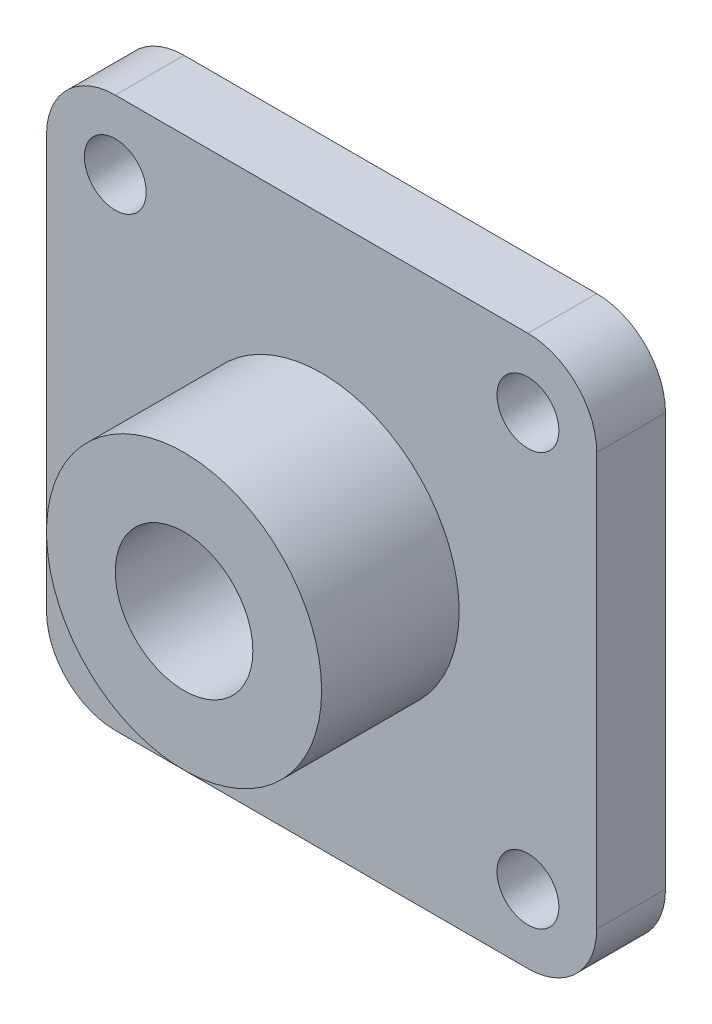
ISO-10303-21;
HEADER;
FILE_DESCRIPTION(('STEP AP214'),'2;1');
FILE_NAME('part.step','',(''),(''),'','','');
FILE_SCHEMA(('AUTOMOTIVE_DESIGN { 1 0 10303 214 1 1 1 1 }'));
ENDSEC;
DATA;
#1=APPLICATION_CONTEXT('core data for automotive mechanical design processes');
#2=APPLICATION_PROTOCOL_DEFINITION('international standard','automotive_design',2000,#1);
#3=PRODUCT_CONTEXT('',#1,'mechanical');
#4=PRODUCT('Part','Part','',(#3));
#5=PRODUCT_RELATED_PRODUCT_CATEGORY('part','',(#4));
#6=PRODUCT_DEFINITION_FORMATION('','',#4);
#7=PRODUCT_DEFINITION_CONTEXT('part definition',#1,'design');
#8=PRODUCT_DEFINITION('design','',#6,#7);
#9=PRODUCT_DEFINITION_SHAPE('','',#8);
#10=(LENGTH_UNIT() NAMED_UNIT(*) SI_UNIT(.MILLI.,.METRE.));
#11=(NAMED_UNIT(*) PLANE_ANGLE_UNIT() SI_UNIT($,.RADIAN.));
#12=(NAMED_UNIT(*) SI_UNIT($,.STERADIAN.) SOLID_ANGLE_UNIT());
#13=UNCERTAINTY_MEASURE_WITH_UNIT(LENGTH_MEASURE(1.E-05),#10,'distance_accuracy_value','');
#14=(GEOMETRIC_REPRESENTATION_CONTEXT(3) GLOBAL_UNCERTAINTY_ASSIGNED_CONTEXT((#13)) GLOBAL_UNIT_ASSIGNED_CONTEXT((#10,
#11,#12)) REPRESENTATION_CONTEXT('',''));
#15=CARTESIAN_POINT('',(0.,0.,0.));
#16=DIRECTION('',(0.,0.,1.));
#17=DIRECTION('',(1.,0.,0.));
#18=AXIS2_PLACEMENT_3D('',#15,#16,#17);
#19=CARTESIAN_POINT('',(-30.,-30.,10.));
#20=DIRECTION('',(0.,0.,-1.));
#21=DIRECTION('',(-1.,0.,0.));
#22=AXIS2_PLACEMENT_3D('',#19,#20,#21);
#23=CYLINDRICAL_SURFACE('',#22,10.);
#24=CARTESIAN_POINT('',(-30.,-30.,0.));
#25=DIRECTION('',(0.,0.,1.));
#26=DIRECTION('',(1.,0.,0.));
#27=AXIS2_PLACEMENT_3D('',#24,#25,#26);
#28=CIRCLE('',#27,10.);
#29=CARTESIAN_POINT('',(-40.,-30.,0.));
#30=VERTEX_POINT('',#29);
#31=CARTESIAN_POINT('',(-30.,-40.,0.));
#32=VERTEX_POINT('',#31);
#33=EDGE_CURVE('E158',#30,#32,#28,.T.);
#34=ORIENTED_EDGE('',*,*,#33,.T.);
#35=DIRECTION('',(0.,0.,-1.));
#36=VECTOR('',#35,1.);
#37=CARTESIAN_POINT('',(-30.,-40.,10.));
#38=LINE('',#37,#36);
#39=CARTESIAN_POINT('',(-30.,-40.,10.));
#40=VERTEX_POINT('',#39);
#41=EDGE_CURVE('E62',#40,#32,#38,.T.);
#42=ORIENTED_EDGE('',*,*,#41,.F.);
#43=CARTESIAN_POINT('',(-30.,-30.,10.));
#44=DIRECTION('',(0.,0.,1.));
#45=DIRECTION('',(1.,0.,0.));
#46=AXIS2_PLACEMENT_3D('',#43,#44,#45);
#47=CIRCLE('',#46,10.);
#48=CARTESIAN_POINT('',(-40.,-30.,10.));
#49=VERTEX_POINT('',#48);
#50=EDGE_CURVE('E181',#49,#40,#47,.T.);
#51=ORIENTED_EDGE('',*,*,#50,.F.);
#52=DIRECTION('',(0.,0.,-1.));
#53=VECTOR('',#52,1.);
#54=CARTESIAN_POINT('',(-40.,-30.,10.));
#55=LINE('',#54,#53);
#56=EDGE_CURVE('E154',#49,#30,#55,.T.);
#57=ORIENTED_EDGE('',*,*,#56,.T.);
#58=EDGE_LOOP('',(#34,#42,#51,#57));
#59=FACE_BOUND('',#58,.T.);
#60=ADVANCED_FACE('F51',(#59),#23,.T.);
#61=CARTESIAN_POINT('',(-30.,-40.,10.));
#62=DIRECTION('',(0.,1.,0.));
#63=DIRECTION('',(0.,0.,1.));
#64=AXIS2_PLACEMENT_3D('',#61,#62,#63);
#65=PLANE('',#64);
#66=DIRECTION('',(1.,0.,0.));
#67=VECTOR('',#66,1.);
#68=CARTESIAN_POINT('',(-30.,-40.,0.));
#69=LINE('',#68,#67);
#70=CARTESIAN_POINT('',(30.,-40.,0.));
#71=VERTEX_POINT('',#70);
#72=EDGE_CURVE('E162',#32,#71,#69,.T.);
#73=ORIENTED_EDGE('',*,*,#72,.T.);
#74=DIRECTION('',(0.,0.,-1.));
#75=VECTOR('',#74,1.);
#76=CARTESIAN_POINT('',(30.,-40.,10.));
#77=LINE('',#76,#75);
#78=CARTESIAN_POINT('',(30.,-40.,10.));
#79=VERTEX_POINT('',#78);
#80=EDGE_CURVE('E196',#79,#71,#77,.T.);
#81=ORIENTED_EDGE('',*,*,#80,.F.);
#82=DIRECTION('',(1.,0.,0.));
#83=VECTOR('',#82,1.);
#84=CARTESIAN_POINT('',(-30.,-40.,10.));
#85=LINE('',#84,#83);
#86=EDGE_CURVE('E115',#40,#79,#85,.T.);
#87=ORIENTED_EDGE('',*,*,#86,.F.);
#88=ORIENTED_EDGE('',*,*,#41,.T.);
#89=EDGE_LOOP('',(#73,#81,#87,#88));
#90=FACE_BOUND('',#89,.T.);
#91=ADVANCED_FACE('F277',(#90),#65,.F.);
#92=CARTESIAN_POINT('',(30.,-30.,10.));
#93=DIRECTION('',(0.,0.,-1.));
#94=DIRECTION('',(-1.,0.,0.));
#95=AXIS2_PLACEMENT_3D('',#92,#93,#94);
#96=CYLINDRICAL_SURFACE('',#95,10.);
#97=CARTESIAN_POINT('',(30.,-30.,0.));
#98=DIRECTION('',(0.,0.,1.));
#99=DIRECTION('',(1.,0.,0.));
#100=AXIS2_PLACEMENT_3D('',#97,#98,#99);
#101=CIRCLE('',#100,10.);
#102=CARTESIAN_POINT('',(40.,-30.,0.));
#103=VERTEX_POINT('',#102);
#104=EDGE_CURVE('E166',#71,#103,#101,.T.);
#105=ORIENTED_EDGE('',*,*,#104,.T.);
#106=DIRECTION('',(0.,0.,-1.));
#107=VECTOR('',#106,1.);
#108=CARTESIAN_POINT('',(40.,-30.,10.));
#109=LINE('',#108,#107);
#110=CARTESIAN_POINT('',(40.,-30.,10.));
#111=VERTEX_POINT('',#110);
#112=EDGE_CURVE('E192',#111,#103,#109,.T.);
#113=ORIENTED_EDGE('',*,*,#112,.F.);
#114=CARTESIAN_POINT('',(30.,-30.,10.));
#115=DIRECTION('',(0.,0.,1.));
#116=DIRECTION('',(1.,0.,0.));
#117=AXIS2_PLACEMENT_3D('',#114,#115,#116);
#118=CIRCLE('',#117,10.);
#119=EDGE_CURVE('E239',#79,#111,#118,.T.);
#120=ORIENTED_EDGE('',*,*,#119,.F.);
#121=ORIENTED_EDGE('',*,*,#80,.T.);
#122=EDGE_LOOP('',(#105,#113,#120,#121));
#123=FACE_BOUND('',#122,.T.);
#124=ADVANCED_FACE('F281',(#123),#96,.T.);
#125=CARTESIAN_POINT('',(40.,-30.,10.));
#126=DIRECTION('',(-1.,0.,0.));
#127=DIRECTION('',(0.,0.,1.));
#128=AXIS2_PLACEMENT_3D('',#125,#126,#127);
#129=PLANE('',#128);
#130=DIRECTION('',(0.,1.,0.));
#131=VECTOR('',#130,1.);
#132=CARTESIAN_POINT('',(40.,-30.,0.));
#133=LINE('',#132,#131);
#134=CARTESIAN_POINT('',(40.,30.,0.));
#135=VERTEX_POINT('',#134);
#136=EDGE_CURVE('E169',#103,#135,#133,.T.);
#137=ORIENTED_EDGE('',*,*,#136,.T.);
#138=DIRECTION('',(0.,0.,-1.));
#139=VECTOR('',#138,1.);
#140=CARTESIAN_POINT('',(40.,30.,10.));
#141=LINE('',#140,#139);
#142=CARTESIAN_POINT('',(40.,30.,10.));
#143=VERTEX_POINT('',#142);
#144=EDGE_CURVE('E188',#143,#135,#141,.T.);
#145=ORIENTED_EDGE('',*,*,#144,.F.);
#146=DIRECTION('',(0.,1.,0.));
#147=VECTOR('',#146,1.);
#148=CARTESIAN_POINT('',(40.,-30.,10.));
#149=LINE('',#148,#147);
#150=EDGE_CURVE('E242',#111,#143,#149,.T.);
#151=ORIENTED_EDGE('',*,*,#150,.F.);
#152=ORIENTED_EDGE('',*,*,#112,.T.);
#153=EDGE_LOOP('',(#137,#145,#151,#152));
#154=FACE_BOUND('',#153,.T.);
#155=ADVANCED_FACE('F294',(#154),#129,.F.);
#156=CARTESIAN_POINT('',(30.,30.,10.));
#157=DIRECTION('',(0.,0.,-1.));
#158=DIRECTION('',(-1.,0.,0.));
#159=AXIS2_PLACEMENT_3D('',#156,#157,#158);
#160=CYLINDRICAL_SURFACE('',#159,10.);
#161=CARTESIAN_POINT('',(30.,30.,0.));
#162=DIRECTION('',(0.,0.,1.));
#163=DIRECTION('',(1.,0.,0.));
#164=AXIS2_PLACEMENT_3D('',#161,#162,#163);
#165=CIRCLE('',#164,10.);
#166=CARTESIAN_POINT('',(30.,40.,0.));
#167=VERTEX_POINT('',#166);
#168=EDGE_CURVE('E172',#135,#167,#165,.T.);
#169=ORIENTED_EDGE('',*,*,#168,.T.);
#170=DIRECTION('',(0.,0.,-1.));
#171=VECTOR('',#170,1.);
#172=CARTESIAN_POINT('',(30.,40.,10.));
#173=LINE('',#172,#171);
#174=CARTESIAN_POINT('',(30.,40.,10.));
#175=VERTEX_POINT('',#174);
#176=EDGE_CURVE('E145',#175,#167,#173,.T.);
#177=ORIENTED_EDGE('',*,*,#176,.F.);
#178=CARTESIAN_POINT('',(30.,30.,10.));
#179=DIRECTION('',(0.,0.,1.));
#180=DIRECTION('',(1.,0.,0.));
#181=AXIS2_PLACEMENT_3D('',#178,#179,#180);
#182=CIRCLE('',#181,10.);
#183=EDGE_CURVE('E134',#143,#175,#182,.T.);
#184=ORIENTED_EDGE('',*,*,#183,.F.);
#185=ORIENTED_EDGE('',*,*,#144,.T.);
#186=EDGE_LOOP('',(#169,#177,#184,#185));
#187=FACE_BOUND('',#186,.T.);
#188=ADVANCED_FACE('F297',(#187),#160,.T.);
#189=CARTESIAN_POINT('',(30.,40.,10.));
#190=DIRECTION('',(0.,-1.,0.));
#191=DIRECTION('',(0.,0.,-1.));
#192=AXIS2_PLACEMENT_3D('',#189,#190,#191);
#193=PLANE('',#192);
#194=DIRECTION('',(-1.,0.,0.));
#195=VECTOR('',#194,1.);
#196=CARTESIAN_POINT('',(30.,40.,0.));
#197=LINE('',#196,#195);
#198=CARTESIAN_POINT('',(-30.,40.,0.));
#199=VERTEX_POINT('',#198);
#200=EDGE_CURVE('E143',#167,#199,#197,.T.);
#201=ORIENTED_EDGE('',*,*,#200,.T.);
#202=DIRECTION('',(0.,0.,-1.));
#203=VECTOR('',#202,1.);
#204=CARTESIAN_POINT('',(-30.,40.,10.));
#205=LINE('',#204,#203);
#206=CARTESIAN_POINT('',(-30.,40.,10.));
#207=VERTEX_POINT('',#206);
#208=EDGE_CURVE('E140',#207,#199,#205,.T.);
#209=ORIENTED_EDGE('',*,*,#208,.F.);
#210=DIRECTION('',(-1.,0.,0.));
#211=VECTOR('',#210,1.);
#212=CARTESIAN_POINT('',(30.,40.,10.));
#213=LINE('',#212,#211);
#214=EDGE_CURVE('E128',#175,#207,#213,.T.);
#215=ORIENTED_EDGE('',*,*,#214,.F.);
#216=ORIENTED_EDGE('',*,*,#176,.T.);
#217=EDGE_LOOP('',(#201,#209,#215,#216));
#218=FACE_BOUND('',#217,.T.);
#219=ADVANCED_FACE('F141',(#218),#193,.F.);
#220=CARTESIAN_POINT('',(-30.,30.,10.));
#221=DIRECTION('',(0.,0.,-1.));
#222=DIRECTION('',(-1.,0.,0.));
#223=AXIS2_PLACEMENT_3D('',#220,#221,#222);
#224=CYLINDRICAL_SURFACE('',#223,10.);
#225=CARTESIAN_POINT('',(-30.,30.,0.));
#226=DIRECTION('',(0.,0.,1.));
#227=DIRECTION('',(1.,0.,0.));
#228=AXIS2_PLACEMENT_3D('',#225,#226,#227);
#229=CIRCLE('',#228,10.);
#230=CARTESIAN_POINT('',(-40.,30.,0.));
#231=VERTEX_POINT('',#230);
#232=EDGE_CURVE('E100',#199,#231,#229,.T.);
#233=ORIENTED_EDGE('',*,*,#232,.T.);
#234=DIRECTION('',(0.,0.,-1.));
#235=VECTOR('',#234,1.);
#236=CARTESIAN_POINT('',(-40.,30.,10.));
#237=LINE('',#236,#235);
#238=CARTESIAN_POINT('',(-40.,30.,10.));
#239=VERTEX_POINT('',#238);
#240=EDGE_CURVE('E146',#239,#231,#237,.T.);
#241=ORIENTED_EDGE('',*,*,#240,.F.);
#242=CARTESIAN_POINT('',(-30.,30.,10.));
#243=DIRECTION('',(0.,0.,1.));
#244=DIRECTION('',(1.,0.,0.));
#245=AXIS2_PLACEMENT_3D('',#242,#243,#244);
#246=CIRCLE('',#245,10.);
#247=EDGE_CURVE('E132',#207,#239,#246,.T.);
#248=ORIENTED_EDGE('',*,*,#247,.F.);
#249=ORIENTED_EDGE('',*,*,#208,.T.);
#250=EDGE_LOOP('',(#233,#241,#248,#249));
#251=FACE_BOUND('',#250,.T.);
#252=ADVANCED_FACE('F148',(#251),#224,.T.);
#253=CARTESIAN_POINT('',(-40.,30.,10.));
#254=DIRECTION('',(1.,0.,0.));
#255=DIRECTION('',(0.,0.,-1.));
#256=AXIS2_PLACEMENT_3D('',#253,#254,#255);
#257=PLANE('',#256);
#258=DIRECTION('',(0.,-1.,0.));
#259=VECTOR('',#258,1.);
#260=CARTESIAN_POINT('',(-40.,30.,0.));
#261=LINE('',#260,#259);
#262=EDGE_CURVE('E106',#231,#30,#261,.T.);
#263=ORIENTED_EDGE('',*,*,#262,.T.);
#264=ORIENTED_EDGE('',*,*,#56,.F.);
#265=DIRECTION('',(0.,-1.,0.));
#266=VECTOR('',#265,1.);
#267=CARTESIAN_POINT('',(-40.,30.,10.));
#268=LINE('',#267,#266);
#269=EDGE_CURVE('E71',#239,#49,#268,.T.);
#270=ORIENTED_EDGE('',*,*,#269,.F.);
#271=ORIENTED_EDGE('',*,*,#240,.T.);
#272=EDGE_LOOP('',(#263,#264,#270,#271));
#273=FACE_BOUND('',#272,.T.);
#274=ADVANCED_FACE('F257',(#273),#257,.F.);
#275=CARTESIAN_POINT('',(-30.,-30.,10.));
#276=DIRECTION('',(0.,0.,1.));
#277=DIRECTION('',(1.,0.,0.));
#278=AXIS2_PLACEMENT_3D('',#275,#276,#277);
#279=PLANE('',#278);
#280=CARTESIAN_POINT('',(30.,-30.,9.99999999999999));
#281=DIRECTION('',(0.,0.,1.));
#282=DIRECTION('',(1.,0.,0.));
#283=AXIS2_PLACEMENT_3D('',#280,#281,#282);
#284=CIRCLE('',#283,4.5);
#285=CARTESIAN_POINT('',(34.5,-30.,9.99999999999999));
#286=VERTEX_POINT('',#285);
#287=EDGE_CURVE('E229',#286,#286,#284,.T.);
#288=ORIENTED_EDGE('',*,*,#287,.F.);
#289=EDGE_LOOP('',(#288));
#290=FACE_BOUND('',#289,.T.);
#291=CARTESIAN_POINT('',(-30.,-30.,9.99999999999999));
#292=DIRECTION('',(0.,0.,1.));
#293=DIRECTION('',(1.,0.,0.));
#294=AXIS2_PLACEMENT_3D('',#291,#292,#293);
#295=CIRCLE('',#294,4.5);
#296=CARTESIAN_POINT('',(-25.5,-30.,9.99999999999999));
#297=VERTEX_POINT('',#296);
#298=EDGE_CURVE('E214',#297,#297,#295,.T.);
#299=ORIENTED_EDGE('',*,*,#298,.F.);
#300=EDGE_LOOP('',(#299));
#301=FACE_BOUND('',#300,.T.);
#302=CARTESIAN_POINT('',(-30.,30.,9.99999999999999));
#303=DIRECTION('',(0.,0.,1.));
#304=DIRECTION('',(1.,0.,0.));
#305=AXIS2_PLACEMENT_3D('',#302,#303,#304);
#306=CIRCLE('',#305,4.5);
#307=CARTESIAN_POINT('',(-25.5,30.,9.99999999999999));
#308=VERTEX_POINT('',#307);
#309=EDGE_CURVE('E210',#308,#308,#306,.T.);
#310=ORIENTED_EDGE('',*,*,#309,.F.);
#311=EDGE_LOOP('',(#310));
#312=FACE_BOUND('',#311,.T.);
#313=CARTESIAN_POINT('',(30.,30.,9.99999999999999));
#314=DIRECTION('',(0.,0.,1.));
#315=DIRECTION('',(1.,0.,0.));
#316=AXIS2_PLACEMENT_3D('',#313,#314,#315);
#317=CIRCLE('',#316,4.5);
#318=CARTESIAN_POINT('',(34.5,30.,9.99999999999999));
#319=VERTEX_POINT('',#318);
#320=EDGE_CURVE('E206',#319,#319,#317,.T.);
#321=ORIENTED_EDGE('',*,*,#320,.F.);
#322=EDGE_LOOP('',(#321));
#323=FACE_BOUND('',#322,.T.);
#324=CARTESIAN_POINT('',(0.,0.,10.));
#325=DIRECTION('',(0.,0.,1.));
#326=DIRECTION('',(1.,0.,0.));
#327=AXIS2_PLACEMENT_3D('',#324,#325,#326);
#328=CIRCLE('',#327,20.);
#329=CARTESIAN_POINT('',(20.,0.,10.));
#330=VERTEX_POINT('',#329);
#331=EDGE_CURVE('E11',#330,#330,#328,.T.);
#332=ORIENTED_EDGE('',*,*,#331,.F.);
#333=EDGE_LOOP('',(#332));
#334=FACE_BOUND('',#333,.T.);
#335=ORIENTED_EDGE('',*,*,#50,.T.);
#336=ORIENTED_EDGE('',*,*,#86,.T.);
#337=ORIENTED_EDGE('',*,*,#119,.T.);
#338=ORIENTED_EDGE('',*,*,#150,.T.);
#339=ORIENTED_EDGE('',*,*,#183,.T.);
#340=ORIENTED_EDGE('',*,*,#214,.T.);
#341=ORIENTED_EDGE('',*,*,#247,.T.);
#342=ORIENTED_EDGE('',*,*,#269,.T.);
#343=EDGE_LOOP('',(#335,#336,#337,#338,#339,#340,#341,#342));
#344=FACE_BOUND('',#343,.T.);
#345=ADVANCED_FACE('F130',(#290,#301,#312,#323,#334,#344),#279,.T.);
#346=CARTESIAN_POINT('',(-30.,-30.,0.));
#347=DIRECTION('',(0.,0.,1.));
#348=DIRECTION('',(1.,0.,0.));
#349=AXIS2_PLACEMENT_3D('',#346,#347,#348);
#350=PLANE('',#349);
#351=CARTESIAN_POINT('',(0.,0.,0.));
#352=DIRECTION('',(0.,0.,1.));
#353=DIRECTION('',(1.,0.,0.));
#354=AXIS2_PLACEMENT_3D('',#351,#352,#353);
#355=CIRCLE('',#354,10.);
#356=CARTESIAN_POINT('',(10.,0.,0.));
#357=VERTEX_POINT('',#356);
#358=EDGE_CURVE('E207',#357,#357,#355,.T.);
#359=ORIENTED_EDGE('',*,*,#358,.T.);
#360=EDGE_LOOP('',(#359));
#361=FACE_BOUND('',#360,.T.);
#362=CARTESIAN_POINT('',(30.,-30.,0.));
#363=DIRECTION('',(0.,0.,1.));
#364=DIRECTION('',(1.,0.,0.));
#365=AXIS2_PLACEMENT_3D('',#362,#363,#364);
#366=CIRCLE('',#365,4.5);
#367=CARTESIAN_POINT('',(34.5,-30.,0.));
#368=VERTEX_POINT('',#367);
#369=EDGE_CURVE('E55',#368,#368,#366,.T.);
#370=ORIENTED_EDGE('',*,*,#369,.T.);
#371=EDGE_LOOP('',(#370));
#372=FACE_BOUND('',#371,.T.);
#373=CARTESIAN_POINT('',(-30.,-30.,0.));
#374=DIRECTION('',(0.,0.,1.));
#375=DIRECTION('',(1.,0.,0.));
#376=AXIS2_PLACEMENT_3D('',#373,#374,#375);
#377=CIRCLE('',#376,4.5);
#378=CARTESIAN_POINT('',(-25.5,-30.,0.));
#379=VERTEX_POINT('',#378);
#380=EDGE_CURVE('E211',#379,#379,#377,.T.);
#381=ORIENTED_EDGE('',*,*,#380,.T.);
#382=EDGE_LOOP('',(#381));
#383=FACE_BOUND('',#382,.T.);
#384=CARTESIAN_POINT('',(-30.,30.,0.));
#385=DIRECTION('',(0.,0.,1.));
#386=DIRECTION('',(1.,0.,0.));
#387=AXIS2_PLACEMENT_3D('',#384,#385,#386);
#388=CIRCLE('',#387,4.5);
#389=CARTESIAN_POINT('',(-25.5,30.,0.));
#390=VERTEX_POINT('',#389);
#391=EDGE_CURVE('E208',#390,#390,#388,.T.);
#392=ORIENTED_EDGE('',*,*,#391,.T.);
#393=EDGE_LOOP('',(#392));
#394=FACE_BOUND('',#393,.T.);
#395=CARTESIAN_POINT('',(30.,30.,0.));
#396=DIRECTION('',(0.,0.,1.));
#397=DIRECTION('',(1.,0.,0.));
#398=AXIS2_PLACEMENT_3D('',#395,#396,#397);
#399=CIRCLE('',#398,4.5);
#400=CARTESIAN_POINT('',(34.5,30.,0.));
#401=VERTEX_POINT('',#400);
#402=EDGE_CURVE('E202',#401,#401,#399,.T.);
#403=ORIENTED_EDGE('',*,*,#402,.T.);
#404=EDGE_LOOP('',(#403));
#405=FACE_BOUND('',#404,.T.);
#406=ORIENTED_EDGE('',*,*,#33,.F.);
#407=ORIENTED_EDGE('',*,*,#262,.F.);
#408=ORIENTED_EDGE('',*,*,#232,.F.);
#409=ORIENTED_EDGE('',*,*,#200,.F.);
#410=ORIENTED_EDGE('',*,*,#168,.F.);
#411=ORIENTED_EDGE('',*,*,#136,.F.);
#412=ORIENTED_EDGE('',*,*,#104,.F.);
#413=ORIENTED_EDGE('',*,*,#72,.F.);
#414=EDGE_LOOP('',(#406,#407,#408,#409,#410,#411,#412,#413));
#415=FACE_BOUND('',#414,.T.);
#416=ADVANCED_FACE('F256',(#361,#372,#383,#394,#405,#415),#350,.F.);
#417=CARTESIAN_POINT('',(0.,0.,30.));
#418=DIRECTION('',(0.,0.,-1.));
#419=DIRECTION('',(-1.,0.,0.));
#420=AXIS2_PLACEMENT_3D('',#417,#418,#419);
#421=CYLINDRICAL_SURFACE('',#420,20.);
#422=CARTESIAN_POINT('',(0.,0.,30.));
#423=DIRECTION('',(0.,0.,1.));
#424=DIRECTION('',(1.,0.,0.));
#425=AXIS2_PLACEMENT_3D('',#422,#423,#424);
#426=CIRCLE('',#425,20.);
#427=CARTESIAN_POINT('',(20.,0.,30.));
#428=VERTEX_POINT('',#427);
#429=EDGE_CURVE('E163',#428,#428,#426,.T.);
#430=ORIENTED_EDGE('',*,*,#429,.F.);
#431=EDGE_LOOP('',(#430));
#432=FACE_BOUND('',#431,.T.);
#433=ORIENTED_EDGE('',*,*,#331,.T.);
#434=EDGE_LOOP('',(#433));
#435=FACE_BOUND('',#434,.T.);
#436=ADVANCED_FACE('F262',(#432,#435),#421,.T.);
#437=CARTESIAN_POINT('',(0.,0.,30.));
#438=DIRECTION('',(0.,0.,1.));
#439=DIRECTION('',(1.,0.,0.));
#440=AXIS2_PLACEMENT_3D('',#437,#438,#439);
#441=PLANE('',#440);
#442=CARTESIAN_POINT('',(0.,0.,30.));
#443=DIRECTION('',(0.,0.,1.));
#444=DIRECTION('',(1.,0.,0.));
#445=AXIS2_PLACEMENT_3D('',#442,#443,#444);
#446=CIRCLE('',#445,10.);
#447=CARTESIAN_POINT('',(10.,0.,30.));
#448=VERTEX_POINT('',#447);
#449=EDGE_CURVE('E246',#448,#448,#446,.T.);
#450=ORIENTED_EDGE('',*,*,#449,.F.);
#451=EDGE_LOOP('',(#450));
#452=FACE_BOUND('',#451,.T.);
#453=ORIENTED_EDGE('',*,*,#429,.T.);
#454=EDGE_LOOP('',(#453));
#455=FACE_BOUND('',#454,.T.);
#456=ADVANCED_FACE('F264',(#452,#455),#441,.T.);
#457=CARTESIAN_POINT('',(30.,30.,-81.));
#458=DIRECTION('',(0.,0.,1.));
#459=DIRECTION('',(1.,0.,0.));
#460=AXIS2_PLACEMENT_3D('',#457,#458,#459);
#461=CYLINDRICAL_SURFACE('',#460,4.5);
#462=ORIENTED_EDGE('',*,*,#320,.T.);
#463=EDGE_LOOP('',(#462));
#464=FACE_BOUND('',#463,.T.);
#465=ORIENTED_EDGE('',*,*,#402,.F.);
#466=EDGE_LOOP('',(#465));
#467=FACE_BOUND('',#466,.T.);
#468=ADVANCED_FACE('F251',(#464,#467),#461,.F.);
#469=CARTESIAN_POINT('',(-30.,30.,-81.));
#470=DIRECTION('',(0.,0.,1.));
#471=DIRECTION('',(1.,0.,0.));
#472=AXIS2_PLACEMENT_3D('',#469,#470,#471);
#473=CYLINDRICAL_SURFACE('',#472,4.5);
#474=ORIENTED_EDGE('',*,*,#309,.T.);
#475=EDGE_LOOP('',(#474));
#476=FACE_BOUND('',#475,.T.);
#477=ORIENTED_EDGE('',*,*,#391,.F.);
#478=EDGE_LOOP('',(#477));
#479=FACE_BOUND('',#478,.T.);
#480=ADVANCED_FACE('F359',(#476,#479),#473,.F.);
#481=CARTESIAN_POINT('',(-30.,-30.,-81.));
#482=DIRECTION('',(0.,0.,1.));
#483=DIRECTION('',(1.,0.,0.));
#484=AXIS2_PLACEMENT_3D('',#481,#482,#483);
#485=CYLINDRICAL_SURFACE('',#484,4.5);
#486=ORIENTED_EDGE('',*,*,#298,.T.);
#487=EDGE_LOOP('',(#486));
#488=FACE_BOUND('',#487,.T.);
#489=ORIENTED_EDGE('',*,*,#380,.F.);
#490=EDGE_LOOP('',(#489));
#491=FACE_BOUND('',#490,.T.);
#492=ADVANCED_FACE('F366',(#488,#491),#485,.F.);
#493=CARTESIAN_POINT('',(30.,-30.,-81.));
#494=DIRECTION('',(0.,0.,1.));
#495=DIRECTION('',(1.,0.,0.));
#496=AXIS2_PLACEMENT_3D('',#493,#494,#495);
#497=CYLINDRICAL_SURFACE('',#496,4.5);
#498=ORIENTED_EDGE('',*,*,#287,.T.);
#499=EDGE_LOOP('',(#498));
#500=FACE_BOUND('',#499,.T.);
#501=ORIENTED_EDGE('',*,*,#369,.F.);
#502=EDGE_LOOP('',(#501));
#503=FACE_BOUND('',#502,.T.);
#504=ADVANCED_FACE('F373',(#500,#503),#497,.F.);
#505=CARTESIAN_POINT('',(0.,0.,0.));
#506=DIRECTION('',(0.,0.,1.));
#507=DIRECTION('',(1.,0.,0.));
#508=AXIS2_PLACEMENT_3D('',#505,#506,#507);
#509=CYLINDRICAL_SURFACE('',#508,10.);
#510=ORIENTED_EDGE('',*,*,#358,.F.);
#511=EDGE_LOOP('',(#510));
#512=FACE_BOUND('',#511,.T.);
#513=ORIENTED_EDGE('',*,*,#449,.T.);
#514=EDGE_LOOP('',(#513));
#515=FACE_BOUND('',#514,.T.);
#516=ADVANCED_FACE('F380',(#512,#515),#509,.F.);
#517=CLOSED_SHELL('',(#60,#91,#124,#155,#188,#219,#252,#274,#345,#416,#436,#456,#468,#480,#492,
#504,#516));
#518=MANIFOLD_SOLID_BREP('B2',#517);
#519=ADVANCED_BREP_SHAPE_REPRESENTATION('',(#18,#518),#14);
#520=SHAPE_DEFINITION_REPRESENTATION(#9,#519);
ENDSEC;
END-ISO-10303-21;
